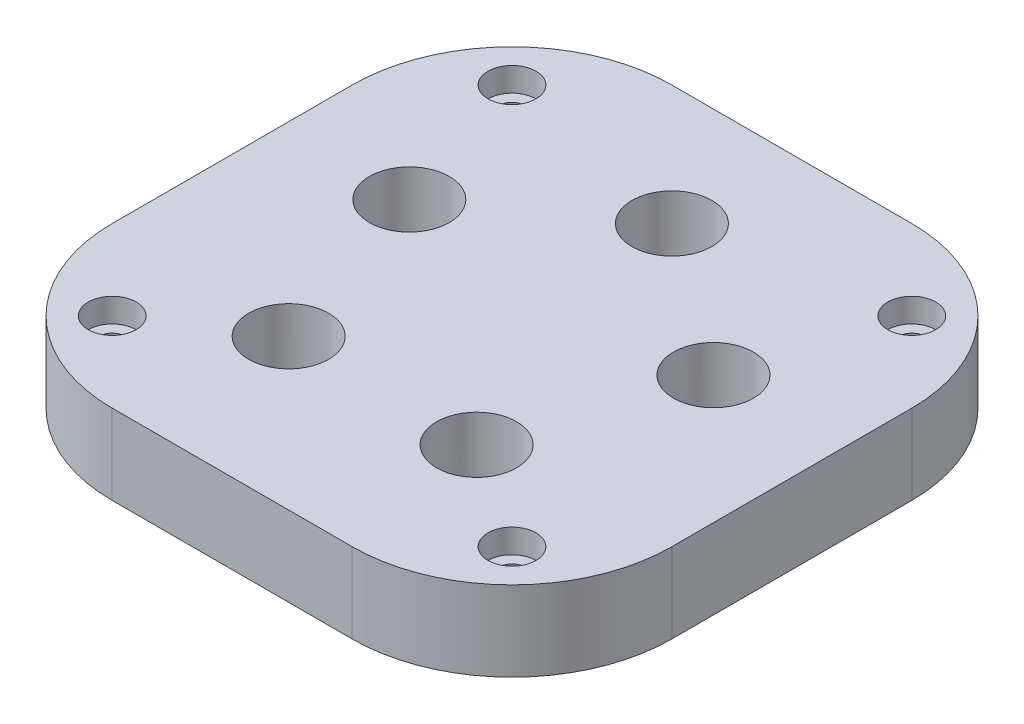
ISO-10303-21;
HEADER;
FILE_DESCRIPTION(('STEP AP214'),'2;1');
FILE_NAME('part.step','',(''),(''),'','','');
FILE_SCHEMA(('AUTOMOTIVE_DESIGN { 1 0 10303 214 1 1 1 1 }'));
ENDSEC;
DATA;
#1=APPLICATION_CONTEXT('core data for automotive mechanical design processes');
#2=APPLICATION_PROTOCOL_DEFINITION('international standard','automotive_design',2000,#1);
#3=PRODUCT_CONTEXT('',#1,'mechanical');
#4=PRODUCT('Part','Part','',(#3));
#5=PRODUCT_RELATED_PRODUCT_CATEGORY('part','',(#4));
#6=PRODUCT_DEFINITION_FORMATION('','',#4);
#7=PRODUCT_DEFINITION_CONTEXT('part definition',#1,'design');
#8=PRODUCT_DEFINITION('design','',#6,#7);
#9=PRODUCT_DEFINITION_SHAPE('','',#8);
#10=(LENGTH_UNIT() NAMED_UNIT(*) SI_UNIT(.MILLI.,.METRE.));
#11=(NAMED_UNIT(*) PLANE_ANGLE_UNIT() SI_UNIT($,.RADIAN.));
#12=(NAMED_UNIT(*) SI_UNIT($,.STERADIAN.) SOLID_ANGLE_UNIT());
#13=UNCERTAINTY_MEASURE_WITH_UNIT(LENGTH_MEASURE(1.E-05),#10,'distance_accuracy_value','');
#14=(GEOMETRIC_REPRESENTATION_CONTEXT(3) GLOBAL_UNCERTAINTY_ASSIGNED_CONTEXT((#13)) GLOBAL_UNIT_ASSIGNED_CONTEXT((#10,
#11,#12)) REPRESENTATION_CONTEXT('',''));
#15=CARTESIAN_POINT('',(0.,0.,0.));
#16=DIRECTION('',(0.,0.,1.));
#17=DIRECTION('',(1.,0.,0.));
#18=AXIS2_PLACEMENT_3D('',#15,#16,#17);
#19=CARTESIAN_POINT('',(10.,10.,-60.));
#20=DIRECTION('',(0.,-1.,0.));
#21=DIRECTION('',(0.,0.,-1.));
#22=AXIS2_PLACEMENT_3D('',#19,#20,#21);
#23=CYLINDRICAL_SURFACE('',#22,1.6);
#24=CARTESIAN_POINT('',(10.,0.,-60.));
#25=DIRECTION('',(0.,1.,0.));
#26=DIRECTION('',(0.,0.,1.));
#27=AXIS2_PLACEMENT_3D('',#24,#25,#26);
#28=CIRCLE('',#27,1.6);
#29=CARTESIAN_POINT('',(10.,0.,-58.4));
#30=VERTEX_POINT('',#29);
#31=EDGE_CURVE('E147',#30,#30,#28,.T.);
#32=ORIENTED_EDGE('',*,*,#31,.F.);
#33=EDGE_LOOP('',(#32));
#34=FACE_BOUND('',#33,.T.);
#35=CARTESIAN_POINT('',(10.,7.,-60.));
#36=DIRECTION('',(0.,1.,0.));
#37=DIRECTION('',(0.,0.,1.));
#38=AXIS2_PLACEMENT_3D('',#35,#36,#37);
#39=CIRCLE('',#38,1.6);
#40=CARTESIAN_POINT('',(10.,7.,-58.4));
#41=VERTEX_POINT('',#40);
#42=EDGE_CURVE('E42',#41,#41,#39,.T.);
#43=ORIENTED_EDGE('',*,*,#42,.T.);
#44=EDGE_LOOP('',(#43));
#45=FACE_BOUND('',#44,.T.);
#46=ADVANCED_FACE('F38',(#34,#45),#23,.F.);
#47=CARTESIAN_POINT('',(60.,10.,-60.));
#48=DIRECTION('',(0.,-1.,0.));
#49=DIRECTION('',(0.,0.,-1.));
#50=AXIS2_PLACEMENT_3D('',#47,#48,#49);
#51=CYLINDRICAL_SURFACE('',#50,1.60000000000001);
#52=CARTESIAN_POINT('',(60.,0.,-60.));
#53=DIRECTION('',(0.,1.,0.));
#54=DIRECTION('',(0.,0.,1.));
#55=AXIS2_PLACEMENT_3D('',#52,#53,#54);
#56=CIRCLE('',#55,1.60000000000001);
#57=CARTESIAN_POINT('',(60.,0.,-58.4));
#58=VERTEX_POINT('',#57);
#59=EDGE_CURVE('E242',#58,#58,#56,.T.);
#60=ORIENTED_EDGE('',*,*,#59,.F.);
#61=EDGE_LOOP('',(#60));
#62=FACE_BOUND('',#61,.T.);
#63=CARTESIAN_POINT('',(60.,7.,-60.));
#64=DIRECTION('',(0.,1.,0.));
#65=DIRECTION('',(0.,0.,1.));
#66=AXIS2_PLACEMENT_3D('',#63,#64,#65);
#67=CIRCLE('',#66,1.60000000000001);
#68=CARTESIAN_POINT('',(60.,7.,-58.4));
#69=VERTEX_POINT('',#68);
#70=EDGE_CURVE('E213',#69,#69,#67,.T.);
#71=ORIENTED_EDGE('',*,*,#70,.T.);
#72=EDGE_LOOP('',(#71));
#73=FACE_BOUND('',#72,.T.);
#74=ADVANCED_FACE('F399',(#62,#73),#51,.F.);
#75=CARTESIAN_POINT('',(60.,10.,-10.));
#76=DIRECTION('',(0.,-1.,0.));
#77=DIRECTION('',(0.,0.,-1.));
#78=AXIS2_PLACEMENT_3D('',#75,#76,#77);
#79=CYLINDRICAL_SURFACE('',#78,1.6);
#80=CARTESIAN_POINT('',(60.,0.,-10.));
#81=DIRECTION('',(0.,1.,0.));
#82=DIRECTION('',(0.,0.,1.));
#83=AXIS2_PLACEMENT_3D('',#80,#81,#82);
#84=CIRCLE('',#83,1.6);
#85=CARTESIAN_POINT('',(60.,0.,-8.4));
#86=VERTEX_POINT('',#85);
#87=EDGE_CURVE('E238',#86,#86,#84,.T.);
#88=ORIENTED_EDGE('',*,*,#87,.F.);
#89=EDGE_LOOP('',(#88));
#90=FACE_BOUND('',#89,.T.);
#91=CARTESIAN_POINT('',(60.,7.,-10.));
#92=DIRECTION('',(0.,1.,0.));
#93=DIRECTION('',(0.,0.,1.));
#94=AXIS2_PLACEMENT_3D('',#91,#92,#93);
#95=CIRCLE('',#94,1.6);
#96=CARTESIAN_POINT('',(60.,7.,-8.4));
#97=VERTEX_POINT('',#96);
#98=EDGE_CURVE('E209',#97,#97,#95,.T.);
#99=ORIENTED_EDGE('',*,*,#98,.T.);
#100=EDGE_LOOP('',(#99));
#101=FACE_BOUND('',#100,.T.);
#102=ADVANCED_FACE('F347',(#90,#101),#79,.F.);
#103=CARTESIAN_POINT('',(10.,10.,-10.));
#104=DIRECTION('',(0.,-1.,0.));
#105=DIRECTION('',(0.,0.,-1.));
#106=AXIS2_PLACEMENT_3D('',#103,#104,#105);
#107=CYLINDRICAL_SURFACE('',#106,1.6);
#108=CARTESIAN_POINT('',(10.,0.,-10.));
#109=DIRECTION('',(0.,1.,0.));
#110=DIRECTION('',(0.,0.,1.));
#111=AXIS2_PLACEMENT_3D('',#108,#109,#110);
#112=CIRCLE('',#111,1.6);
#113=CARTESIAN_POINT('',(10.,0.,-8.4));
#114=VERTEX_POINT('',#113);
#115=EDGE_CURVE('E204',#114,#114,#112,.T.);
#116=ORIENTED_EDGE('',*,*,#115,.F.);
#117=EDGE_LOOP('',(#116));
#118=FACE_BOUND('',#117,.T.);
#119=CARTESIAN_POINT('',(10.,7.,-10.));
#120=DIRECTION('',(0.,1.,0.));
#121=DIRECTION('',(0.,0.,1.));
#122=AXIS2_PLACEMENT_3D('',#119,#120,#121);
#123=CIRCLE('',#122,1.6);
#124=CARTESIAN_POINT('',(10.,7.,-8.4));
#125=VERTEX_POINT('',#124);
#126=EDGE_CURVE('E205',#125,#125,#123,.T.);
#127=ORIENTED_EDGE('',*,*,#126,.T.);
#128=EDGE_LOOP('',(#127));
#129=FACE_BOUND('',#128,.T.);
#130=ADVANCED_FACE('F344',(#118,#129),#107,.F.);
#131=CARTESIAN_POINT('',(20.,10.,-20.));
#132=DIRECTION('',(0.,-1.,0.));
#133=DIRECTION('',(0.,0.,-1.));
#134=AXIS2_PLACEMENT_3D('',#131,#132,#133);
#135=PLANE('',#134);
#136=CARTESIAN_POINT('',(10.,10.,-10.));
#137=DIRECTION('',(0.,1.,0.));
#138=DIRECTION('',(0.,0.,1.));
#139=AXIS2_PLACEMENT_3D('',#136,#137,#138);
#140=CIRCLE('',#139,3.);
#141=CARTESIAN_POINT('',(10.,10.,-7.));
#142=VERTEX_POINT('',#141);
#143=EDGE_CURVE('E279',#142,#142,#140,.T.);
#144=ORIENTED_EDGE('',*,*,#143,.F.);
#145=EDGE_LOOP('',(#144));
#146=FACE_BOUND('',#145,.T.);
#147=CARTESIAN_POINT('',(60.,10.,-10.));
#148=DIRECTION('',(0.,1.,0.));
#149=DIRECTION('',(0.,0.,1.));
#150=AXIS2_PLACEMENT_3D('',#147,#148,#149);
#151=CIRCLE('',#150,3.);
#152=CARTESIAN_POINT('',(60.,10.,-7.));
#153=VERTEX_POINT('',#152);
#154=EDGE_CURVE('E288',#153,#153,#151,.T.);
#155=ORIENTED_EDGE('',*,*,#154,.F.);
#156=EDGE_LOOP('',(#155));
#157=FACE_BOUND('',#156,.T.);
#158=CARTESIAN_POINT('',(60.,10.,-60.));
#159=DIRECTION('',(0.,1.,0.));
#160=DIRECTION('',(0.,0.,1.));
#161=AXIS2_PLACEMENT_3D('',#158,#159,#160);
#162=CIRCLE('',#161,3.);
#163=CARTESIAN_POINT('',(60.,10.,-57.));
#164=VERTEX_POINT('',#163);
#165=EDGE_CURVE('E296',#164,#164,#162,.T.);
#166=ORIENTED_EDGE('',*,*,#165,.F.);
#167=EDGE_LOOP('',(#166));
#168=FACE_BOUND('',#167,.T.);
#169=CARTESIAN_POINT('',(10.,10.,-60.));
#170=DIRECTION('',(0.,1.,0.));
#171=DIRECTION('',(0.,0.,1.));
#172=AXIS2_PLACEMENT_3D('',#169,#170,#171);
#173=CIRCLE('',#172,3.);
#174=CARTESIAN_POINT('',(10.,10.,-57.));
#175=VERTEX_POINT('',#174);
#176=EDGE_CURVE('E271',#175,#175,#173,.T.);
#177=ORIENTED_EDGE('',*,*,#176,.F.);
#178=EDGE_LOOP('',(#177));
#179=FACE_BOUND('',#178,.T.);
#180=CARTESIAN_POINT('',(35.,10.,-55.));
#181=DIRECTION('',(0.,1.,0.));
#182=DIRECTION('',(0.,0.,1.));
#183=AXIS2_PLACEMENT_3D('',#180,#181,#182);
#184=CIRCLE('',#183,5.);
#185=CARTESIAN_POINT('',(35.,10.,-50.));
#186=VERTEX_POINT('',#185);
#187=EDGE_CURVE('E188',#186,#186,#184,.T.);
#188=ORIENTED_EDGE('',*,*,#187,.F.);
#189=EDGE_LOOP('',(#188));
#190=FACE_BOUND('',#189,.T.);
#191=CARTESIAN_POINT('',(54.0211303259054,10.,-41.1803398875021));
#192=DIRECTION('',(0.,1.,0.));
#193=DIRECTION('',(0.,0.,1.));
#194=AXIS2_PLACEMENT_3D('',#191,#192,#193);
#195=CIRCLE('',#194,5.);
#196=CARTESIAN_POINT('',(54.0211303259054,10.,-36.1803398875021));
#197=VERTEX_POINT('',#196);
#198=EDGE_CURVE('E262',#197,#197,#195,.T.);
#199=ORIENTED_EDGE('',*,*,#198,.F.);
#200=EDGE_LOOP('',(#199));
#201=FACE_BOUND('',#200,.T.);
#202=CARTESIAN_POINT('',(46.7557050458555,10.,-18.819660112503));
#203=DIRECTION('',(0.,1.,0.));
#204=DIRECTION('',(0.,0.,1.));
#205=AXIS2_PLACEMENT_3D('',#202,#203,#204);
#206=CIRCLE('',#205,4.99999999999999);
#207=CARTESIAN_POINT('',(46.7557050458555,10.,-13.819660112503));
#208=VERTEX_POINT('',#207);
#209=EDGE_CURVE('E231',#208,#208,#206,.T.);
#210=ORIENTED_EDGE('',*,*,#209,.F.);
#211=EDGE_LOOP('',(#210));
#212=FACE_BOUND('',#211,.T.);
#213=CARTESIAN_POINT('',(23.2442949541566,10.,-18.8196601124991));
#214=DIRECTION('',(0.,1.,0.));
#215=DIRECTION('',(0.,0.,1.));
#216=AXIS2_PLACEMENT_3D('',#213,#214,#215);
#217=CIRCLE('',#216,5.);
#218=CARTESIAN_POINT('',(23.2442949541566,10.,-13.8196601124991));
#219=VERTEX_POINT('',#218);
#220=EDGE_CURVE('E225',#219,#219,#217,.T.);
#221=ORIENTED_EDGE('',*,*,#220,.F.);
#222=EDGE_LOOP('',(#221));
#223=FACE_BOUND('',#222,.T.);
#224=CARTESIAN_POINT('',(15.9788696740994,10.,-41.1803398874959));
#225=DIRECTION('',(0.,1.,0.));
#226=DIRECTION('',(0.,0.,1.));
#227=AXIS2_PLACEMENT_3D('',#224,#225,#226);
#228=CIRCLE('',#227,5.);
#229=CARTESIAN_POINT('',(15.9788696740994,10.,-36.1803398874959));
#230=VERTEX_POINT('',#229);
#231=EDGE_CURVE('E220',#230,#230,#228,.T.);
#232=ORIENTED_EDGE('',*,*,#231,.F.);
#233=EDGE_LOOP('',(#232));
#234=FACE_BOUND('',#233,.T.);
#235=CARTESIAN_POINT('',(20.,10.,-20.));
#236=DIRECTION('',(0.,1.,0.));
#237=DIRECTION('',(0.,0.,-1.));
#238=AXIS2_PLACEMENT_3D('',#235,#236,#237);
#239=CIRCLE('',#238,20.);
#240=CARTESIAN_POINT('',(0.,10.,-20.));
#241=VERTEX_POINT('',#240);
#242=CARTESIAN_POINT('',(20.,10.,0.));
#243=VERTEX_POINT('',#242);
#244=EDGE_CURVE('E165',#241,#243,#239,.T.);
#245=ORIENTED_EDGE('',*,*,#244,.T.);
#246=DIRECTION('',(1.,0.,0.));
#247=VECTOR('',#246,1.);
#248=CARTESIAN_POINT('',(20.,10.,0.));
#249=LINE('',#248,#247);
#250=CARTESIAN_POINT('',(50.,10.,0.));
#251=VERTEX_POINT('',#250);
#252=EDGE_CURVE('E101',#243,#251,#249,.T.);
#253=ORIENTED_EDGE('',*,*,#252,.T.);
#254=CARTESIAN_POINT('',(50.,10.,-20.));
#255=DIRECTION('',(0.,1.,0.));
#256=DIRECTION('',(0.,0.,1.));
#257=AXIS2_PLACEMENT_3D('',#254,#255,#256);
#258=CIRCLE('',#257,20.);
#259=CARTESIAN_POINT('',(70.,10.,-20.));
#260=VERTEX_POINT('',#259);
#261=EDGE_CURVE('E253',#251,#260,#258,.T.);
#262=ORIENTED_EDGE('',*,*,#261,.T.);
#263=DIRECTION('',(0.,0.,-1.));
#264=VECTOR('',#263,1.);
#265=CARTESIAN_POINT('',(70.,10.,-20.));
#266=LINE('',#265,#264);
#267=CARTESIAN_POINT('',(70.,10.,-50.));
#268=VERTEX_POINT('',#267);
#269=EDGE_CURVE('E256',#260,#268,#266,.T.);
#270=ORIENTED_EDGE('',*,*,#269,.T.);
#271=CARTESIAN_POINT('',(50.,10.,-50.));
#272=DIRECTION('',(0.,1.,0.));
#273=DIRECTION('',(0.,0.,-1.));
#274=AXIS2_PLACEMENT_3D('',#271,#272,#273);
#275=CIRCLE('',#274,20.);
#276=CARTESIAN_POINT('',(50.,10.,-70.));
#277=VERTEX_POINT('',#276);
#278=EDGE_CURVE('E120',#268,#277,#275,.T.);
#279=ORIENTED_EDGE('',*,*,#278,.T.);
#280=DIRECTION('',(-1.,0.,0.));
#281=VECTOR('',#280,1.);
#282=CARTESIAN_POINT('',(20.,10.,-70.));
#283=LINE('',#282,#281);
#284=CARTESIAN_POINT('',(20.,10.,-70.));
#285=VERTEX_POINT('',#284);
#286=EDGE_CURVE('E114',#277,#285,#283,.T.);
#287=ORIENTED_EDGE('',*,*,#286,.T.);
#288=CARTESIAN_POINT('',(20.,10.,-50.));
#289=DIRECTION('',(0.,1.,0.));
#290=DIRECTION('',(0.,0.,-1.));
#291=AXIS2_PLACEMENT_3D('',#288,#289,#290);
#292=CIRCLE('',#291,20.);
#293=CARTESIAN_POINT('',(0.,10.,-50.));
#294=VERTEX_POINT('',#293);
#295=EDGE_CURVE('E118',#285,#294,#292,.T.);
#296=ORIENTED_EDGE('',*,*,#295,.T.);
#297=DIRECTION('',(0.,0.,1.));
#298=VECTOR('',#297,1.);
#299=CARTESIAN_POINT('',(0.,10.,-20.));
#300=LINE('',#299,#298);
#301=EDGE_CURVE('E58',#294,#241,#300,.T.);
#302=ORIENTED_EDGE('',*,*,#301,.T.);
#303=EDGE_LOOP('',(#245,#253,#262,#270,#279,#287,#296,#302));
#304=FACE_BOUND('',#303,.T.);
#305=ADVANCED_FACE('F116',(#146,#157,#168,#179,#190,#201,#212,#223,#234,#304),#135,.F.);
#306=CARTESIAN_POINT('',(20.,0.,-20.));
#307=DIRECTION('',(0.,-1.,0.));
#308=DIRECTION('',(0.,0.,-1.));
#309=AXIS2_PLACEMENT_3D('',#306,#307,#308);
#310=PLANE('',#309);
#311=CARTESIAN_POINT('',(35.,0.,-35.));
#312=DIRECTION('',(0.,-1.,0.));
#313=DIRECTION('',(0.,0.,-1.));
#314=AXIS2_PLACEMENT_3D('',#311,#312,#313);
#315=CIRCLE('',#314,3.5);
#316=CARTESIAN_POINT('',(35.,0.,-38.5));
#317=VERTEX_POINT('',#316);
#318=EDGE_CURVE('E303',#317,#317,#315,.T.);
#319=ORIENTED_EDGE('',*,*,#318,.F.);
#320=EDGE_LOOP('',(#319));
#321=FACE_BOUND('',#320,.T.);
#322=CARTESIAN_POINT('',(35.,0.,-55.));
#323=DIRECTION('',(0.,-1.,0.));
#324=DIRECTION('',(0.,0.,-1.));
#325=AXIS2_PLACEMENT_3D('',#322,#323,#324);
#326=CIRCLE('',#325,5.);
#327=CARTESIAN_POINT('',(35.,0.,-60.));
#328=VERTEX_POINT('',#327);
#329=EDGE_CURVE('E200',#328,#328,#326,.T.);
#330=ORIENTED_EDGE('',*,*,#329,.F.);
#331=EDGE_LOOP('',(#330));
#332=FACE_BOUND('',#331,.T.);
#333=CARTESIAN_POINT('',(54.0211303259054,0.,-41.1803398875021));
#334=DIRECTION('',(0.,-1.,0.));
#335=DIRECTION('',(0.,0.,-1.));
#336=AXIS2_PLACEMENT_3D('',#333,#334,#335);
#337=CIRCLE('',#336,5.);
#338=CARTESIAN_POINT('',(54.0211303259054,0.,-46.1803398875021));
#339=VERTEX_POINT('',#338);
#340=EDGE_CURVE('E196',#339,#339,#337,.T.);
#341=ORIENTED_EDGE('',*,*,#340,.F.);
#342=EDGE_LOOP('',(#341));
#343=FACE_BOUND('',#342,.T.);
#344=CARTESIAN_POINT('',(46.7557050458555,0.,-18.819660112503));
#345=DIRECTION('',(0.,-1.,0.));
#346=DIRECTION('',(0.,0.,-1.));
#347=AXIS2_PLACEMENT_3D('',#344,#345,#346);
#348=CIRCLE('',#347,4.99999999999999);
#349=CARTESIAN_POINT('',(46.7557050458555,0.,-23.819660112503));
#350=VERTEX_POINT('',#349);
#351=EDGE_CURVE('E192',#350,#350,#348,.T.);
#352=ORIENTED_EDGE('',*,*,#351,.F.);
#353=EDGE_LOOP('',(#352));
#354=FACE_BOUND('',#353,.T.);
#355=CARTESIAN_POINT('',(23.2442949541566,0.,-18.8196601124991));
#356=DIRECTION('',(0.,-1.,0.));
#357=DIRECTION('',(0.,0.,-1.));
#358=AXIS2_PLACEMENT_3D('',#355,#356,#357);
#359=CIRCLE('',#358,5.);
#360=CARTESIAN_POINT('',(23.2442949541566,0.,-23.8196601124991));
#361=VERTEX_POINT('',#360);
#362=EDGE_CURVE('E187',#361,#361,#359,.T.);
#363=ORIENTED_EDGE('',*,*,#362,.F.);
#364=EDGE_LOOP('',(#363));
#365=FACE_BOUND('',#364,.T.);
#366=CARTESIAN_POINT('',(15.9788696740994,0.,-41.1803398874959));
#367=DIRECTION('',(0.,-1.,0.));
#368=DIRECTION('',(0.,0.,-1.));
#369=AXIS2_PLACEMENT_3D('',#366,#367,#368);
#370=CIRCLE('',#369,5.);
#371=CARTESIAN_POINT('',(15.9788696740994,0.,-46.1803398874959));
#372=VERTEX_POINT('',#371);
#373=EDGE_CURVE('E183',#372,#372,#370,.T.);
#374=ORIENTED_EDGE('',*,*,#373,.F.);
#375=EDGE_LOOP('',(#374));
#376=FACE_BOUND('',#375,.T.);
#377=ORIENTED_EDGE('',*,*,#87,.T.);
#378=EDGE_LOOP('',(#377));
#379=FACE_BOUND('',#378,.T.);
#380=ORIENTED_EDGE('',*,*,#31,.T.);
#381=EDGE_LOOP('',(#380));
#382=FACE_BOUND('',#381,.T.);
#383=CARTESIAN_POINT('',(20.,0.,-20.));
#384=DIRECTION('',(0.,1.,0.));
#385=DIRECTION('',(0.,0.,-1.));
#386=AXIS2_PLACEMENT_3D('',#383,#384,#385);
#387=CIRCLE('',#386,20.);
#388=CARTESIAN_POINT('',(0.,0.,-20.));
#389=VERTEX_POINT('',#388);
#390=CARTESIAN_POINT('',(20.,0.,0.));
#391=VERTEX_POINT('',#390);
#392=EDGE_CURVE('E142',#389,#391,#387,.T.);
#393=ORIENTED_EDGE('',*,*,#392,.F.);
#394=DIRECTION('',(0.,0.,1.));
#395=VECTOR('',#394,1.);
#396=CARTESIAN_POINT('',(0.,0.,-20.));
#397=LINE('',#396,#395);
#398=CARTESIAN_POINT('',(0.,0.,-50.));
#399=VERTEX_POINT('',#398);
#400=EDGE_CURVE('E93',#399,#389,#397,.T.);
#401=ORIENTED_EDGE('',*,*,#400,.F.);
#402=CARTESIAN_POINT('',(20.,0.,-50.));
#403=DIRECTION('',(0.,1.,0.));
#404=DIRECTION('',(0.,0.,-1.));
#405=AXIS2_PLACEMENT_3D('',#402,#403,#404);
#406=CIRCLE('',#405,20.);
#407=CARTESIAN_POINT('',(20.,0.,-70.));
#408=VERTEX_POINT('',#407);
#409=EDGE_CURVE('E87',#408,#399,#406,.T.);
#410=ORIENTED_EDGE('',*,*,#409,.F.);
#411=DIRECTION('',(-1.,0.,0.));
#412=VECTOR('',#411,1.);
#413=CARTESIAN_POINT('',(20.,0.,-70.));
#414=LINE('',#413,#412);
#415=CARTESIAN_POINT('',(50.,0.,-70.));
#416=VERTEX_POINT('',#415);
#417=EDGE_CURVE('E129',#416,#408,#414,.T.);
#418=ORIENTED_EDGE('',*,*,#417,.F.);
#419=CARTESIAN_POINT('',(50.,0.,-50.));
#420=DIRECTION('',(0.,1.,0.));
#421=DIRECTION('',(0.,0.,-1.));
#422=AXIS2_PLACEMENT_3D('',#419,#420,#421);
#423=CIRCLE('',#422,20.);
#424=CARTESIAN_POINT('',(70.,0.,-50.));
#425=VERTEX_POINT('',#424);
#426=EDGE_CURVE('E156',#425,#416,#423,.T.);
#427=ORIENTED_EDGE('',*,*,#426,.F.);
#428=DIRECTION('',(0.,0.,-1.));
#429=VECTOR('',#428,1.);
#430=CARTESIAN_POINT('',(70.,0.,-20.));
#431=LINE('',#430,#429);
#432=CARTESIAN_POINT('',(70.,0.,-20.));
#433=VERTEX_POINT('',#432);
#434=EDGE_CURVE('E153',#433,#425,#431,.T.);
#435=ORIENTED_EDGE('',*,*,#434,.F.);
#436=CARTESIAN_POINT('',(50.,0.,-20.));
#437=DIRECTION('',(0.,1.,0.));
#438=DIRECTION('',(0.,0.,1.));
#439=AXIS2_PLACEMENT_3D('',#436,#437,#438);
#440=CIRCLE('',#439,20.);
#441=CARTESIAN_POINT('',(50.,0.,0.));
#442=VERTEX_POINT('',#441);
#443=EDGE_CURVE('E150',#442,#433,#440,.T.);
#444=ORIENTED_EDGE('',*,*,#443,.F.);
#445=DIRECTION('',(1.,0.,0.));
#446=VECTOR('',#445,1.);
#447=CARTESIAN_POINT('',(20.,0.,0.));
#448=LINE('',#447,#446);
#449=EDGE_CURVE('E146',#391,#442,#448,.T.);
#450=ORIENTED_EDGE('',*,*,#449,.F.);
#451=EDGE_LOOP('',(#393,#401,#410,#418,#427,#435,#444,#450));
#452=FACE_BOUND('',#451,.T.);
#453=ORIENTED_EDGE('',*,*,#59,.T.);
#454=EDGE_LOOP('',(#453));
#455=FACE_BOUND('',#454,.T.);
#456=ORIENTED_EDGE('',*,*,#115,.T.);
#457=EDGE_LOOP('',(#456));
#458=FACE_BOUND('',#457,.T.);
#459=ADVANCED_FACE('F320',(#321,#332,#343,#354,#365,#376,#379,#382,#452,#455,#458),#310,.T.);
#460=CARTESIAN_POINT('',(20.,10.,-20.));
#461=DIRECTION('',(0.,-1.,0.));
#462=DIRECTION('',(0.,0.,-1.));
#463=AXIS2_PLACEMENT_3D('',#460,#461,#462);
#464=CYLINDRICAL_SURFACE('',#463,20.);
#465=ORIENTED_EDGE('',*,*,#392,.T.);
#466=DIRECTION('',(0.,-1.,0.));
#467=VECTOR('',#466,1.);
#468=CARTESIAN_POINT('',(20.,10.,0.));
#469=LINE('',#468,#467);
#470=EDGE_CURVE('E11',#243,#391,#469,.T.);
#471=ORIENTED_EDGE('',*,*,#470,.F.);
#472=ORIENTED_EDGE('',*,*,#244,.F.);
#473=DIRECTION('',(0.,-1.,0.));
#474=VECTOR('',#473,1.);
#475=CARTESIAN_POINT('',(0.,10.,-20.));
#476=LINE('',#475,#474);
#477=EDGE_CURVE('E138',#241,#389,#476,.T.);
#478=ORIENTED_EDGE('',*,*,#477,.T.);
#479=EDGE_LOOP('',(#465,#471,#472,#478));
#480=FACE_BOUND('',#479,.T.);
#481=ADVANCED_FACE('F40',(#480),#464,.T.);
#482=CARTESIAN_POINT('',(20.,10.,0.));
#483=DIRECTION('',(0.,0.,-1.));
#484=DIRECTION('',(-1.,0.,0.));
#485=AXIS2_PLACEMENT_3D('',#482,#483,#484);
#486=PLANE('',#485);
#487=ORIENTED_EDGE('',*,*,#449,.T.);
#488=DIRECTION('',(0.,-1.,0.));
#489=VECTOR('',#488,1.);
#490=CARTESIAN_POINT('',(50.,10.,0.));
#491=LINE('',#490,#489);
#492=EDGE_CURVE('E49',#251,#442,#491,.T.);
#493=ORIENTED_EDGE('',*,*,#492,.F.);
#494=ORIENTED_EDGE('',*,*,#252,.F.);
#495=ORIENTED_EDGE('',*,*,#470,.T.);
#496=EDGE_LOOP('',(#487,#493,#494,#495));
#497=FACE_BOUND('',#496,.T.);
#498=ADVANCED_FACE('F426',(#497),#486,.F.);
#499=CARTESIAN_POINT('',(50.,10.,-20.));
#500=DIRECTION('',(0.,-1.,0.));
#501=DIRECTION('',(0.,0.,-1.));
#502=AXIS2_PLACEMENT_3D('',#499,#500,#501);
#503=CYLINDRICAL_SURFACE('',#502,20.);
#504=ORIENTED_EDGE('',*,*,#443,.T.);
#505=DIRECTION('',(0.,-1.,0.));
#506=VECTOR('',#505,1.);
#507=CARTESIAN_POINT('',(70.,10.,-20.));
#508=LINE('',#507,#506);
#509=EDGE_CURVE('E176',#260,#433,#508,.T.);
#510=ORIENTED_EDGE('',*,*,#509,.F.);
#511=ORIENTED_EDGE('',*,*,#261,.F.);
#512=ORIENTED_EDGE('',*,*,#492,.T.);
#513=EDGE_LOOP('',(#504,#510,#511,#512));
#514=FACE_BOUND('',#513,.T.);
#515=ADVANCED_FACE('F423',(#514),#503,.T.);
#516=CARTESIAN_POINT('',(70.,10.,-20.));
#517=DIRECTION('',(-1.,0.,0.));
#518=DIRECTION('',(0.,0.,1.));
#519=AXIS2_PLACEMENT_3D('',#516,#517,#518);
#520=PLANE('',#519);
#521=ORIENTED_EDGE('',*,*,#434,.T.);
#522=DIRECTION('',(0.,-1.,0.));
#523=VECTOR('',#522,1.);
#524=CARTESIAN_POINT('',(70.,10.,-50.));
#525=LINE('',#524,#523);
#526=EDGE_CURVE('E172',#268,#425,#525,.T.);
#527=ORIENTED_EDGE('',*,*,#526,.F.);
#528=ORIENTED_EDGE('',*,*,#269,.F.);
#529=ORIENTED_EDGE('',*,*,#509,.T.);
#530=EDGE_LOOP('',(#521,#527,#528,#529));
#531=FACE_BOUND('',#530,.T.);
#532=ADVANCED_FACE('F419',(#531),#520,.F.);
#533=CARTESIAN_POINT('',(50.,10.,-50.));
#534=DIRECTION('',(0.,-1.,0.));
#535=DIRECTION('',(0.,0.,-1.));
#536=AXIS2_PLACEMENT_3D('',#533,#534,#535);
#537=CYLINDRICAL_SURFACE('',#536,20.);
#538=ORIENTED_EDGE('',*,*,#426,.T.);
#539=DIRECTION('',(0.,-1.,0.));
#540=VECTOR('',#539,1.);
#541=CARTESIAN_POINT('',(50.,10.,-70.));
#542=LINE('',#541,#540);
#543=EDGE_CURVE('E131',#277,#416,#542,.T.);
#544=ORIENTED_EDGE('',*,*,#543,.F.);
#545=ORIENTED_EDGE('',*,*,#278,.F.);
#546=ORIENTED_EDGE('',*,*,#526,.T.);
#547=EDGE_LOOP('',(#538,#544,#545,#546));
#548=FACE_BOUND('',#547,.T.);
#549=ADVANCED_FACE('F416',(#548),#537,.T.);
#550=CARTESIAN_POINT('',(20.,10.,-70.));
#551=DIRECTION('',(0.,0.,1.));
#552=DIRECTION('',(1.,0.,0.));
#553=AXIS2_PLACEMENT_3D('',#550,#551,#552);
#554=PLANE('',#553);
#555=ORIENTED_EDGE('',*,*,#417,.T.);
#556=DIRECTION('',(0.,-1.,0.));
#557=VECTOR('',#556,1.);
#558=CARTESIAN_POINT('',(20.,10.,-70.));
#559=LINE('',#558,#557);
#560=EDGE_CURVE('E126',#285,#408,#559,.T.);
#561=ORIENTED_EDGE('',*,*,#560,.F.);
#562=ORIENTED_EDGE('',*,*,#286,.F.);
#563=ORIENTED_EDGE('',*,*,#543,.T.);
#564=EDGE_LOOP('',(#555,#561,#562,#563));
#565=FACE_BOUND('',#564,.T.);
#566=ADVANCED_FACE('F127',(#565),#554,.F.);
#567=CARTESIAN_POINT('',(20.,10.,-50.));
#568=DIRECTION('',(0.,-1.,0.));
#569=DIRECTION('',(0.,0.,-1.));
#570=AXIS2_PLACEMENT_3D('',#567,#568,#569);
#571=CYLINDRICAL_SURFACE('',#570,20.);
#572=ORIENTED_EDGE('',*,*,#409,.T.);
#573=DIRECTION('',(0.,-1.,0.));
#574=VECTOR('',#573,1.);
#575=CARTESIAN_POINT('',(0.,10.,-50.));
#576=LINE('',#575,#574);
#577=EDGE_CURVE('E132',#294,#399,#576,.T.);
#578=ORIENTED_EDGE('',*,*,#577,.F.);
#579=ORIENTED_EDGE('',*,*,#295,.F.);
#580=ORIENTED_EDGE('',*,*,#560,.T.);
#581=EDGE_LOOP('',(#572,#578,#579,#580));
#582=FACE_BOUND('',#581,.T.);
#583=ADVANCED_FACE('F134',(#582),#571,.T.);
#584=CARTESIAN_POINT('',(0.,10.,-20.));
#585=DIRECTION('',(1.,0.,0.));
#586=DIRECTION('',(0.,0.,-1.));
#587=AXIS2_PLACEMENT_3D('',#584,#585,#586);
#588=PLANE('',#587);
#589=ORIENTED_EDGE('',*,*,#400,.T.);
#590=ORIENTED_EDGE('',*,*,#477,.F.);
#591=ORIENTED_EDGE('',*,*,#301,.F.);
#592=ORIENTED_EDGE('',*,*,#577,.T.);
#593=EDGE_LOOP('',(#589,#590,#591,#592));
#594=FACE_BOUND('',#593,.T.);
#595=ADVANCED_FACE('F395',(#594),#588,.F.);
#596=CARTESIAN_POINT('',(15.9788696740994,-15.,-41.1803398874959));
#597=DIRECTION('',(0.,1.,0.));
#598=DIRECTION('',(0.,0.,1.));
#599=AXIS2_PLACEMENT_3D('',#596,#597,#598);
#600=CYLINDRICAL_SURFACE('',#599,5.);
#601=ORIENTED_EDGE('',*,*,#373,.T.);
#602=EDGE_LOOP('',(#601));
#603=FACE_BOUND('',#602,.T.);
#604=ORIENTED_EDGE('',*,*,#231,.T.);
#605=EDGE_LOOP('',(#604));
#606=FACE_BOUND('',#605,.T.);
#607=ADVANCED_FACE('F385',(#603,#606),#600,.F.);
#608=CARTESIAN_POINT('',(23.2442949541566,-15.,-18.8196601124991));
#609=DIRECTION('',(0.,1.,0.));
#610=DIRECTION('',(0.,0.,1.));
#611=AXIS2_PLACEMENT_3D('',#608,#609,#610);
#612=CYLINDRICAL_SURFACE('',#611,5.);
#613=ORIENTED_EDGE('',*,*,#362,.T.);
#614=EDGE_LOOP('',(#613));
#615=FACE_BOUND('',#614,.T.);
#616=ORIENTED_EDGE('',*,*,#220,.T.);
#617=EDGE_LOOP('',(#616));
#618=FACE_BOUND('',#617,.T.);
#619=ADVANCED_FACE('F382',(#615,#618),#612,.F.);
#620=CARTESIAN_POINT('',(46.7557050458555,-15.,-18.819660112503));
#621=DIRECTION('',(0.,1.,0.));
#622=DIRECTION('',(0.,0.,1.));
#623=AXIS2_PLACEMENT_3D('',#620,#621,#622);
#624=CYLINDRICAL_SURFACE('',#623,4.99999999999999);
#625=ORIENTED_EDGE('',*,*,#351,.T.);
#626=EDGE_LOOP('',(#625));
#627=FACE_BOUND('',#626,.T.);
#628=ORIENTED_EDGE('',*,*,#209,.T.);
#629=EDGE_LOOP('',(#628));
#630=FACE_BOUND('',#629,.T.);
#631=ADVANCED_FACE('F384',(#627,#630),#624,.F.);
#632=CARTESIAN_POINT('',(54.0211303259054,-15.,-41.1803398875021));
#633=DIRECTION('',(0.,1.,0.));
#634=DIRECTION('',(0.,0.,1.));
#635=AXIS2_PLACEMENT_3D('',#632,#633,#634);
#636=CYLINDRICAL_SURFACE('',#635,5.);
#637=ORIENTED_EDGE('',*,*,#340,.T.);
#638=EDGE_LOOP('',(#637));
#639=FACE_BOUND('',#638,.T.);
#640=ORIENTED_EDGE('',*,*,#198,.T.);
#641=EDGE_LOOP('',(#640));
#642=FACE_BOUND('',#641,.T.);
#643=ADVANCED_FACE('F392',(#639,#642),#636,.F.);
#644=CARTESIAN_POINT('',(35.,-15.,-55.));
#645=DIRECTION('',(0.,1.,0.));
#646=DIRECTION('',(0.,0.,1.));
#647=AXIS2_PLACEMENT_3D('',#644,#645,#646);
#648=CYLINDRICAL_SURFACE('',#647,5.);
#649=ORIENTED_EDGE('',*,*,#329,.T.);
#650=EDGE_LOOP('',(#649));
#651=FACE_BOUND('',#650,.T.);
#652=ORIENTED_EDGE('',*,*,#187,.T.);
#653=EDGE_LOOP('',(#652));
#654=FACE_BOUND('',#653,.T.);
#655=ADVANCED_FACE('F361',(#651,#654),#648,.F.);
#656=CARTESIAN_POINT('',(10.,7.,-10.));
#657=DIRECTION('',(0.,1.,0.));
#658=DIRECTION('',(0.,0.,1.));
#659=AXIS2_PLACEMENT_3D('',#656,#657,#658);
#660=CYLINDRICAL_SURFACE('',#659,3.);
#661=CARTESIAN_POINT('',(10.,7.,-10.));
#662=DIRECTION('',(0.,1.,0.));
#663=DIRECTION('',(0.,0.,1.));
#664=AXIS2_PLACEMENT_3D('',#661,#662,#663);
#665=CIRCLE('',#664,3.);
#666=CARTESIAN_POINT('',(10.,7.,-7.));
#667=VERTEX_POINT('',#666);
#668=EDGE_CURVE('E283',#667,#667,#665,.T.);
#669=ORIENTED_EDGE('',*,*,#668,.F.);
#670=EDGE_LOOP('',(#669));
#671=FACE_BOUND('',#670,.T.);
#672=ORIENTED_EDGE('',*,*,#143,.T.);
#673=EDGE_LOOP('',(#672));
#674=FACE_BOUND('',#673,.T.);
#675=ADVANCED_FACE('F355',(#671,#674),#660,.F.);
#676=CARTESIAN_POINT('',(10.,7.,-10.));
#677=DIRECTION('',(0.,1.,0.));
#678=DIRECTION('',(0.,0.,1.));
#679=AXIS2_PLACEMENT_3D('',#676,#677,#678);
#680=PLANE('',#679);
#681=ORIENTED_EDGE('',*,*,#126,.F.);
#682=EDGE_LOOP('',(#681));
#683=FACE_BOUND('',#682,.T.);
#684=ORIENTED_EDGE('',*,*,#668,.T.);
#685=EDGE_LOOP('',(#684));
#686=FACE_BOUND('',#685,.T.);
#687=ADVANCED_FACE('F351',(#683,#686),#680,.T.);
#688=CARTESIAN_POINT('',(60.,7.,-10.));
#689=DIRECTION('',(0.,1.,0.));
#690=DIRECTION('',(0.,0.,1.));
#691=AXIS2_PLACEMENT_3D('',#688,#689,#690);
#692=CYLINDRICAL_SURFACE('',#691,3.);
#693=CARTESIAN_POINT('',(60.,7.,-10.));
#694=DIRECTION('',(0.,1.,0.));
#695=DIRECTION('',(0.,0.,1.));
#696=AXIS2_PLACEMENT_3D('',#693,#694,#695);
#697=CIRCLE('',#696,3.);
#698=CARTESIAN_POINT('',(60.,7.,-7.));
#699=VERTEX_POINT('',#698);
#700=EDGE_CURVE('E292',#699,#699,#697,.T.);
#701=ORIENTED_EDGE('',*,*,#700,.F.);
#702=EDGE_LOOP('',(#701));
#703=FACE_BOUND('',#702,.T.);
#704=ORIENTED_EDGE('',*,*,#154,.T.);
#705=EDGE_LOOP('',(#704));
#706=FACE_BOUND('',#705,.T.);
#707=ADVANCED_FACE('F354',(#703,#706),#692,.F.);
#708=CARTESIAN_POINT('',(60.,7.,-10.));
#709=DIRECTION('',(0.,1.,0.));
#710=DIRECTION('',(0.,0.,1.));
#711=AXIS2_PLACEMENT_3D('',#708,#709,#710);
#712=PLANE('',#711);
#713=ORIENTED_EDGE('',*,*,#98,.F.);
#714=EDGE_LOOP('',(#713));
#715=FACE_BOUND('',#714,.T.);
#716=ORIENTED_EDGE('',*,*,#700,.T.);
#717=EDGE_LOOP('',(#716));
#718=FACE_BOUND('',#717,.T.);
#719=ADVANCED_FACE('F480',(#715,#718),#712,.T.);
#720=CARTESIAN_POINT('',(60.,7.,-60.));
#721=DIRECTION('',(0.,1.,0.));
#722=DIRECTION('',(0.,0.,1.));
#723=AXIS2_PLACEMENT_3D('',#720,#721,#722);
#724=CYLINDRICAL_SURFACE('',#723,3.);
#725=CARTESIAN_POINT('',(60.,7.,-60.));
#726=DIRECTION('',(0.,1.,0.));
#727=DIRECTION('',(0.,0.,1.));
#728=AXIS2_PLACEMENT_3D('',#725,#726,#727);
#729=CIRCLE('',#728,3.);
#730=CARTESIAN_POINT('',(60.,7.,-57.));
#731=VERTEX_POINT('',#730);
#732=EDGE_CURVE('E275',#731,#731,#729,.T.);
#733=ORIENTED_EDGE('',*,*,#732,.F.);
#734=EDGE_LOOP('',(#733));
#735=FACE_BOUND('',#734,.T.);
#736=ORIENTED_EDGE('',*,*,#165,.T.);
#737=EDGE_LOOP('',(#736));
#738=FACE_BOUND('',#737,.T.);
#739=ADVANCED_FACE('F490',(#735,#738),#724,.F.);
#740=CARTESIAN_POINT('',(60.,7.,-60.));
#741=DIRECTION('',(0.,1.,0.));
#742=DIRECTION('',(0.,0.,1.));
#743=AXIS2_PLACEMENT_3D('',#740,#741,#742);
#744=PLANE('',#743);
#745=ORIENTED_EDGE('',*,*,#70,.F.);
#746=EDGE_LOOP('',(#745));
#747=FACE_BOUND('',#746,.T.);
#748=ORIENTED_EDGE('',*,*,#732,.T.);
#749=EDGE_LOOP('',(#748));
#750=FACE_BOUND('',#749,.T.);
#751=ADVANCED_FACE('F500',(#747,#750),#744,.T.);
#752=CARTESIAN_POINT('',(10.,7.,-60.));
#753=DIRECTION('',(0.,1.,0.));
#754=DIRECTION('',(0.,0.,1.));
#755=AXIS2_PLACEMENT_3D('',#752,#753,#754);
#756=CYLINDRICAL_SURFACE('',#755,3.);
#757=CARTESIAN_POINT('',(10.,7.,-60.));
#758=DIRECTION('',(0.,1.,0.));
#759=DIRECTION('',(0.,0.,1.));
#760=AXIS2_PLACEMENT_3D('',#757,#758,#759);
#761=CIRCLE('',#760,3.);
#762=CARTESIAN_POINT('',(10.,7.,-57.));
#763=VERTEX_POINT('',#762);
#764=EDGE_CURVE('E210',#763,#763,#761,.T.);
#765=ORIENTED_EDGE('',*,*,#764,.F.);
#766=EDGE_LOOP('',(#765));
#767=FACE_BOUND('',#766,.T.);
#768=ORIENTED_EDGE('',*,*,#176,.T.);
#769=EDGE_LOOP('',(#768));
#770=FACE_BOUND('',#769,.T.);
#771=ADVANCED_FACE('F510',(#767,#770),#756,.F.);
#772=CARTESIAN_POINT('',(10.,7.,-60.));
#773=DIRECTION('',(0.,1.,0.));
#774=DIRECTION('',(0.,0.,1.));
#775=AXIS2_PLACEMENT_3D('',#772,#773,#774);
#776=PLANE('',#775);
#777=ORIENTED_EDGE('',*,*,#42,.F.);
#778=EDGE_LOOP('',(#777));
#779=FACE_BOUND('',#778,.T.);
#780=ORIENTED_EDGE('',*,*,#764,.T.);
#781=EDGE_LOOP('',(#780));
#782=FACE_BOUND('',#781,.T.);
#783=ADVANCED_FACE('F316',(#779,#782),#776,.T.);
#784=CARTESIAN_POINT('',(35.,5.,-35.));
#785=DIRECTION('',(0.,-1.,0.));
#786=DIRECTION('',(0.,0.,-1.));
#787=AXIS2_PLACEMENT_3D('',#784,#785,#786);
#788=CYLINDRICAL_SURFACE('',#787,3.5);
#789=CARTESIAN_POINT('',(35.,5.,-35.));
#790=DIRECTION('',(0.,-1.,0.));
#791=DIRECTION('',(0.,0.,-1.));
#792=AXIS2_PLACEMENT_3D('',#789,#790,#791);
#793=CIRCLE('',#792,3.5);
#794=CARTESIAN_POINT('',(35.,5.,-38.5));
#795=VERTEX_POINT('',#794);
#796=EDGE_CURVE('E284',#795,#795,#793,.T.);
#797=ORIENTED_EDGE('',*,*,#796,.F.);
#798=EDGE_LOOP('',(#797));
#799=FACE_BOUND('',#798,.T.);
#800=ORIENTED_EDGE('',*,*,#318,.T.);
#801=EDGE_LOOP('',(#800));
#802=FACE_BOUND('',#801,.T.);
#803=ADVANCED_FACE('F313',(#799,#802),#788,.F.);
#804=CARTESIAN_POINT('',(35.,5.,-35.));
#805=DIRECTION('',(0.,-1.,0.));
#806=DIRECTION('',(0.,0.,-1.));
#807=AXIS2_PLACEMENT_3D('',#804,#805,#806);
#808=PLANE('',#807);
#809=ORIENTED_EDGE('',*,*,#796,.T.);
#810=EDGE_LOOP('',(#809));
#811=FACE_BOUND('',#810,.T.);
#812=ADVANCED_FACE('F311',(#811),#808,.T.);
#813=CLOSED_SHELL('',(#46,#74,#102,#130,#305,#459,#481,#498,#515,#532,#549,#566,#583,#595,#607,
#619,#631,#643,#655,#675,#687,#707,#719,#739,#751,#771,#783,#803,#812));
#814=MANIFOLD_SOLID_BREP('B2',#813);
#815=ADVANCED_BREP_SHAPE_REPRESENTATION('',(#18,#814),#14);
#816=SHAPE_DEFINITION_REPRESENTATION(#9,#815);
ENDSEC;
END-ISO-10303-21;
